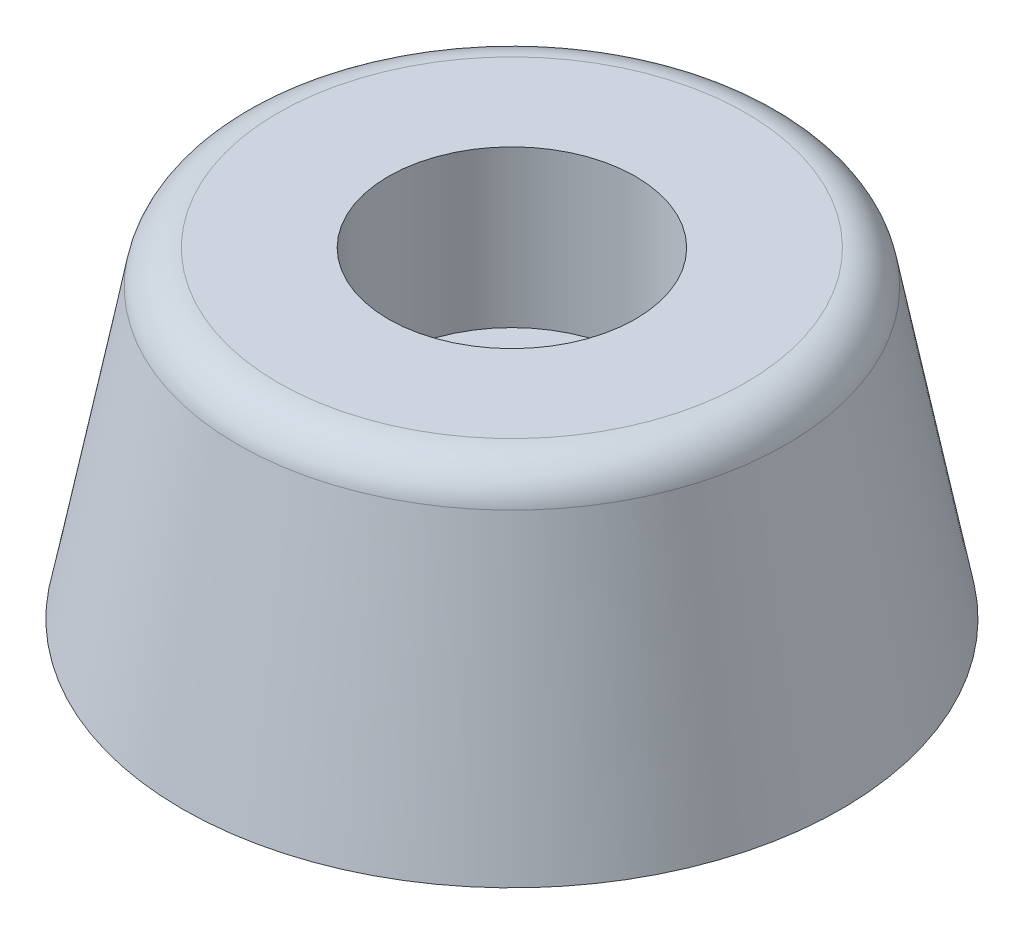
ISO-10303-21;
HEADER;
FILE_DESCRIPTION(('STEP AP214'),'2;1');
FILE_NAME('part.step','',(''),(''),'','','');
FILE_SCHEMA(('AUTOMOTIVE_DESIGN { 1 0 10303 214 1 1 1 1 }'));
ENDSEC;
DATA;
#1=APPLICATION_CONTEXT('core data for automotive mechanical design processes');
#2=APPLICATION_PROTOCOL_DEFINITION('international standard','automotive_design',2000,#1);
#3=PRODUCT_CONTEXT('',#1,'mechanical');
#4=PRODUCT('Part','Part','',(#3));
#5=PRODUCT_RELATED_PRODUCT_CATEGORY('part','',(#4));
#6=PRODUCT_DEFINITION_FORMATION('','',#4);
#7=PRODUCT_DEFINITION_CONTEXT('part definition',#1,'design');
#8=PRODUCT_DEFINITION('design','',#6,#7);
#9=PRODUCT_DEFINITION_SHAPE('','',#8);
#10=(LENGTH_UNIT() NAMED_UNIT(*) SI_UNIT(.MILLI.,.METRE.));
#11=(NAMED_UNIT(*) PLANE_ANGLE_UNIT() SI_UNIT($,.RADIAN.));
#12=(NAMED_UNIT(*) SI_UNIT($,.STERADIAN.) SOLID_ANGLE_UNIT());
#13=UNCERTAINTY_MEASURE_WITH_UNIT(LENGTH_MEASURE(1.E-05),#10,'distance_accuracy_value','');
#14=(GEOMETRIC_REPRESENTATION_CONTEXT(3) GLOBAL_UNCERTAINTY_ASSIGNED_CONTEXT((#13)) GLOBAL_UNIT_ASSIGNED_CONTEXT((#10,
#11,#12)) REPRESENTATION_CONTEXT('',''));
#15=CARTESIAN_POINT('',(0.,0.,0.));
#16=DIRECTION('',(0.,0.,1.));
#17=DIRECTION('',(1.,0.,0.));
#18=AXIS2_PLACEMENT_3D('',#15,#16,#17);
#19=CARTESIAN_POINT('',(0.,7.8,0.));
#20=DIRECTION('',(0.,-1.,0.));
#21=DIRECTION('',(0.,0.,-1.));
#22=AXIS2_PLACEMENT_3D('',#19,#20,#21);
#23=CONICAL_SURFACE('',#22,6.5,0.189988287918715);
#24=CARTESIAN_POINT('',(0.,6.98884739365013,0.));
#25=DIRECTION('',(0.,1.,0.));
#26=DIRECTION('',(0.,0.,1.));
#27=AXIS2_PLACEMENT_3D('',#24,#25,#26);
#28=CIRCLE('',#27,6.65599088583651);
#29=CARTESIAN_POINT('',(0.,6.98884739365013,6.65599088583651));
#30=VERTEX_POINT('',#29);
#31=EDGE_CURVE('E10',#30,#30,#28,.F.);
#32=ORIENTED_EDGE('',*,*,#31,.T.);
#33=EDGE_LOOP('',(#32));
#34=FACE_BOUND('',#33,.T.);
#35=CARTESIAN_POINT('',(0.,0.,0.));
#36=DIRECTION('',(0.,1.,0.));
#37=DIRECTION('',(0.,0.,1.));
#38=AXIS2_PLACEMENT_3D('',#35,#36,#37);
#39=CIRCLE('',#38,8.);
#40=CARTESIAN_POINT('',(0.,0.,8.));
#41=VERTEX_POINT('',#40);
#42=EDGE_CURVE('E75',#41,#41,#39,.T.);
#43=ORIENTED_EDGE('',*,*,#42,.T.);
#44=EDGE_LOOP('',(#43));
#45=FACE_BOUND('',#44,.T.);
#46=ADVANCED_FACE('F43',(#34,#45),#23,.T.);
#47=CARTESIAN_POINT('',(-6.5,7.8,0.));
#48=DIRECTION('',(0.,1.,0.));
#49=DIRECTION('',(0.,0.,1.));
#50=AXIS2_PLACEMENT_3D('',#47,#48,#49);
#51=PLANE('',#50);
#52=CARTESIAN_POINT('',(0.,7.8,0.));
#53=DIRECTION('',(0.,1.,0.));
#54=DIRECTION('',(0.,0.,1.));
#55=AXIS2_PLACEMENT_3D('',#52,#53,#54);
#56=CIRCLE('',#55,5.67398443885587);
#57=CARTESIAN_POINT('',(0.,7.8,5.67398443885587));
#58=VERTEX_POINT('',#57);
#59=EDGE_CURVE('E51',#58,#58,#56,.T.);
#60=ORIENTED_EDGE('',*,*,#59,.T.);
#61=EDGE_LOOP('',(#60));
#62=FACE_BOUND('',#61,.T.);
#63=CARTESIAN_POINT('',(0.,7.8,0.));
#64=DIRECTION('',(0.,1.,0.));
#65=DIRECTION('',(0.,0.,1.));
#66=AXIS2_PLACEMENT_3D('',#63,#64,#65);
#67=CIRCLE('',#66,3.);
#68=CARTESIAN_POINT('',(0.,7.8,3.));
#69=VERTEX_POINT('',#68);
#70=EDGE_CURVE('E56',#69,#69,#67,.T.);
#71=ORIENTED_EDGE('',*,*,#70,.F.);
#72=EDGE_LOOP('',(#71));
#73=FACE_BOUND('',#72,.T.);
#74=ADVANCED_FACE('F95',(#62,#73),#51,.T.);
#75=CARTESIAN_POINT('',(0.,16.1707317073171,0.));
#76=DIRECTION('',(0.,1.,0.));
#77=DIRECTION('',(0.,0.,1.));
#78=AXIS2_PLACEMENT_3D('',#75,#76,#77);
#79=CYLINDRICAL_SURFACE('',#78,3.);
#80=ORIENTED_EDGE('',*,*,#70,.T.);
#81=EDGE_LOOP('',(#80));
#82=FACE_BOUND('',#81,.T.);
#83=CARTESIAN_POINT('',(0.,4.,0.));
#84=DIRECTION('',(0.,1.,0.));
#85=DIRECTION('',(0.,0.,1.));
#86=AXIS2_PLACEMENT_3D('',#83,#84,#85);
#87=CIRCLE('',#86,3.);
#88=CARTESIAN_POINT('',(0.,4.,3.));
#89=VERTEX_POINT('',#88);
#90=EDGE_CURVE('E61',#89,#89,#87,.T.);
#91=ORIENTED_EDGE('',*,*,#90,.F.);
#92=EDGE_LOOP('',(#91));
#93=FACE_BOUND('',#92,.T.);
#94=ADVANCED_FACE('F99',(#82,#93),#79,.F.);
#95=CARTESIAN_POINT('',(-3.,4.,0.));
#96=DIRECTION('',(0.,1.,0.));
#97=DIRECTION('',(0.,0.,1.));
#98=AXIS2_PLACEMENT_3D('',#95,#96,#97);
#99=PLANE('',#98);
#100=ORIENTED_EDGE('',*,*,#90,.T.);
#101=EDGE_LOOP('',(#100));
#102=FACE_BOUND('',#101,.T.);
#103=CARTESIAN_POINT('',(0.,4.,0.));
#104=DIRECTION('',(0.,1.,0.));
#105=DIRECTION('',(0.,0.,1.));
#106=AXIS2_PLACEMENT_3D('',#103,#104,#105);
#107=CIRCLE('',#106,1.5);
#108=CARTESIAN_POINT('',(0.,4.,1.5));
#109=VERTEX_POINT('',#108);
#110=EDGE_CURVE('E67',#109,#109,#107,.T.);
#111=ORIENTED_EDGE('',*,*,#110,.F.);
#112=EDGE_LOOP('',(#111));
#113=FACE_BOUND('',#112,.T.);
#114=ADVANCED_FACE('F92',(#102,#113),#99,.T.);
#115=CARTESIAN_POINT('',(0.,16.1707317073171,0.));
#116=DIRECTION('',(0.,1.,0.));
#117=DIRECTION('',(0.,0.,1.));
#118=AXIS2_PLACEMENT_3D('',#115,#116,#117);
#119=CYLINDRICAL_SURFACE('',#118,1.5);
#120=ORIENTED_EDGE('',*,*,#110,.T.);
#121=EDGE_LOOP('',(#120));
#122=FACE_BOUND('',#121,.T.);
#123=CARTESIAN_POINT('',(0.,0.,0.));
#124=DIRECTION('',(0.,1.,0.));
#125=DIRECTION('',(0.,0.,1.));
#126=AXIS2_PLACEMENT_3D('',#123,#124,#125);
#127=CIRCLE('',#126,1.5);
#128=CARTESIAN_POINT('',(0.,0.,1.5));
#129=VERTEX_POINT('',#128);
#130=EDGE_CURVE('E71',#129,#129,#127,.T.);
#131=ORIENTED_EDGE('',*,*,#130,.F.);
#132=EDGE_LOOP('',(#131));
#133=FACE_BOUND('',#132,.T.);
#134=ADVANCED_FACE('F83',(#122,#133),#119,.F.);
#135=CARTESIAN_POINT('',(-1.5,0.,0.));
#136=DIRECTION('',(0.,-1.,0.));
#137=DIRECTION('',(0.,0.,-1.));
#138=AXIS2_PLACEMENT_3D('',#135,#136,#137);
#139=PLANE('',#138);
#140=ORIENTED_EDGE('',*,*,#130,.T.);
#141=EDGE_LOOP('',(#140));
#142=FACE_BOUND('',#141,.T.);
#143=ORIENTED_EDGE('',*,*,#42,.F.);
#144=EDGE_LOOP('',(#143));
#145=FACE_BOUND('',#144,.T.);
#146=ADVANCED_FACE('F81',(#142,#145),#139,.T.);
#147=CARTESIAN_POINT('',(0.,6.8,0.));
#148=DIRECTION('',(0.,1.,0.));
#149=DIRECTION('',(0.,0.,1.));
#150=AXIS2_PLACEMENT_3D('',#147,#148,#149);
#151=TOROIDAL_SURFACE('',#150,5.67398443885587,1.);
#152=ORIENTED_EDGE('',*,*,#31,.F.);
#153=EDGE_LOOP('',(#152));
#154=FACE_BOUND('',#153,.T.);
#155=ORIENTED_EDGE('',*,*,#59,.F.);
#156=EDGE_LOOP('',(#155));
#157=FACE_BOUND('',#156,.T.);
#158=ADVANCED_FACE('F45',(#154,#157),#151,.T.);
#159=CLOSED_SHELL('',(#46,#74,#94,#114,#134,#146,#158));
#160=MANIFOLD_SOLID_BREP('B2',#159);
#161=ADVANCED_BREP_SHAPE_REPRESENTATION('',(#18,#160),#14);
#162=SHAPE_DEFINITION_REPRESENTATION(#9,#161);
ENDSEC;
END-ISO-10303-21;
